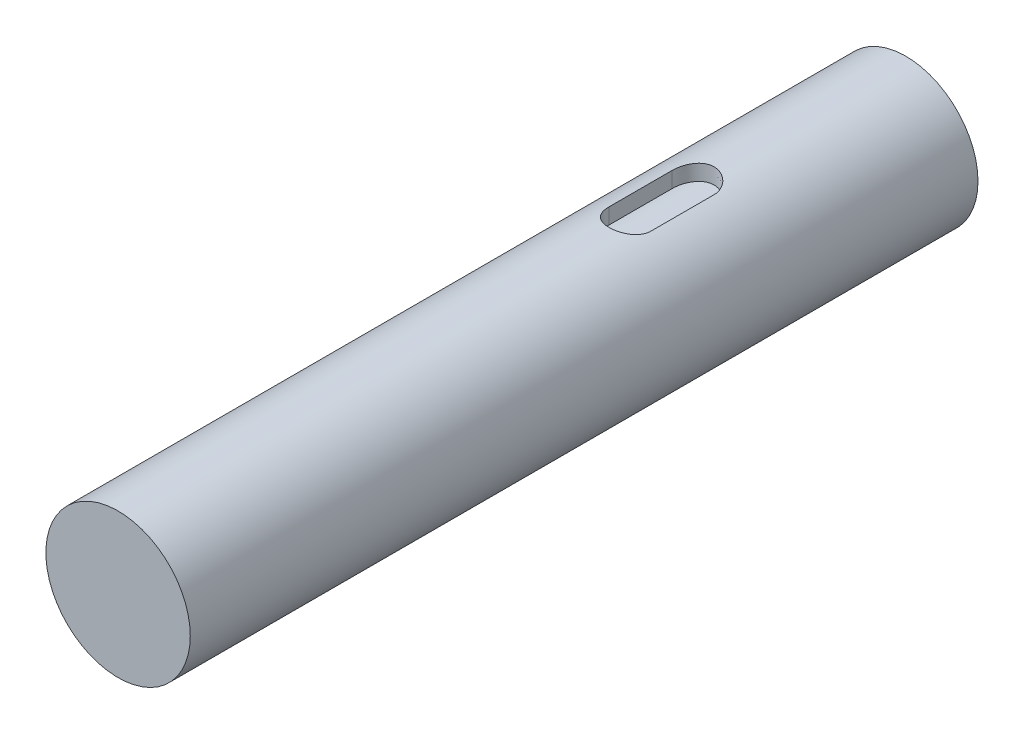
ISO-10303-21;
HEADER;
FILE_DESCRIPTION(('STEP AP214'),'2;1');
FILE_NAME('part.step','',(''),(''),'','','');
FILE_SCHEMA(('AUTOMOTIVE_DESIGN { 1 0 10303 214 1 1 1 1 }'));
ENDSEC;
DATA;
#1=APPLICATION_CONTEXT('core data for automotive mechanical design processes');
#2=APPLICATION_PROTOCOL_DEFINITION('international standard','automotive_design',2000,#1);
#3=PRODUCT_CONTEXT('',#1,'mechanical');
#4=PRODUCT('Part','Part','',(#3));
#5=PRODUCT_RELATED_PRODUCT_CATEGORY('part','',(#4));
#6=PRODUCT_DEFINITION_FORMATION('','',#4);
#7=PRODUCT_DEFINITION_CONTEXT('part definition',#1,'design');
#8=PRODUCT_DEFINITION('design','',#6,#7);
#9=PRODUCT_DEFINITION_SHAPE('','',#8);
#10=(LENGTH_UNIT() NAMED_UNIT(*) SI_UNIT(.MILLI.,.METRE.));
#11=(NAMED_UNIT(*) PLANE_ANGLE_UNIT() SI_UNIT($,.RADIAN.));
#12=(NAMED_UNIT(*) SI_UNIT($,.STERADIAN.) SOLID_ANGLE_UNIT());
#13=UNCERTAINTY_MEASURE_WITH_UNIT(LENGTH_MEASURE(1.E-05),#10,'distance_accuracy_value','');
#14=(GEOMETRIC_REPRESENTATION_CONTEXT(3) GLOBAL_UNCERTAINTY_ASSIGNED_CONTEXT((#13)) GLOBAL_UNIT_ASSIGNED_CONTEXT((#10,
#11,#12)) REPRESENTATION_CONTEXT('',''));
#15=CARTESIAN_POINT('',(0.,0.,0.));
#16=DIRECTION('',(0.,0.,1.));
#17=DIRECTION('',(1.,0.,0.));
#18=AXIS2_PLACEMENT_3D('',#15,#16,#17);
#19=CARTESIAN_POINT('',(0.,0.,300.));
#20=DIRECTION('',(0.,0.,-1.));
#21=DIRECTION('',(-1.,0.,0.));
#22=AXIS2_PLACEMENT_3D('',#19,#20,#21);
#23=CYLINDRICAL_SURFACE('',#22,27.5);
#24=CARTESIAN_POINT('',(0.,0.,0.));
#25=DIRECTION('',(0.,0.,1.));
#26=DIRECTION('',(1.,0.,0.));
#27=AXIS2_PLACEMENT_3D('',#24,#25,#26);
#28=CIRCLE('',#27,27.5);
#29=CARTESIAN_POINT('',(27.5,0.,0.));
#30=VERTEX_POINT('',#29);
#31=EDGE_CURVE('E49',#30,#30,#28,.T.);
#32=ORIENTED_EDGE('',*,*,#31,.T.);
#33=EDGE_LOOP('',(#32));
#34=FACE_BOUND('',#33,.T.);
#35=CARTESIAN_POINT('',(0.,0.,300.));
#36=DIRECTION('',(0.,0.,1.));
#37=DIRECTION('',(1.,0.,0.));
#38=AXIS2_PLACEMENT_3D('',#35,#36,#37);
#39=CIRCLE('',#38,27.5);
#40=CARTESIAN_POINT('',(27.5,0.,300.));
#41=VERTEX_POINT('',#40);
#42=EDGE_CURVE('E11',#41,#41,#39,.T.);
#43=ORIENTED_EDGE('',*,*,#42,.F.);
#44=EDGE_LOOP('',(#43));
#45=FACE_BOUND('',#44,.T.);
#46=DIRECTION('',(0.,0.,-1.));
#47=VECTOR('',#46,1.);
#48=CARTESIAN_POINT('',(8.00000000000003,26.3106442338457,300.));
#49=LINE('',#48,#47);
#50=CARTESIAN_POINT('',(8.00000000000001,26.3106442338457,105.));
#51=VERTEX_POINT('',#50);
#52=CARTESIAN_POINT('',(8.00000000000002,26.3106442338457,81.));
#53=VERTEX_POINT('',#52);
#54=EDGE_CURVE('E185',#51,#53,#49,.T.);
#55=ORIENTED_EDGE('',*,*,#54,.F.);
#56=CARTESIAN_POINT('',(-8.,26.3106442338457,105.));
#57=CARTESIAN_POINT('',(-8.,26.3106442338457,106.063035005528));
#58=CARTESIAN_POINT('',(-7.7887011777006,26.3772734647265,107.105523905988));
#59=CARTESIAN_POINT('',(-6.98411937352506,26.6016258534104,109.039699683214));
#60=CARTESIAN_POINT('',(-6.39053384658964,26.7576658191,109.923095257943));
#61=CARTESIAN_POINT('',(-4.92378688162708,27.0659920504562,111.390000978678));
#62=CARTESIAN_POINT('',(-4.03629409406878,27.2193681309942,111.985161836937));
#63=CARTESIAN_POINT('',(-2.11382482197526,27.4356960197185,112.785621396139));
#64=CARTESIAN_POINT('',(-1.05749070925455,27.4997033906854,112.998980405045));
#65=CARTESIAN_POINT('',(1.04200741030025,27.5002944299277,113.001012103311));
#66=CARTESIAN_POINT('',(2.09275072984243,27.437705693647,112.792846434513));
#67=CARTESIAN_POINT('',(4.03739168654416,27.2196026370311,111.986238582998));
#68=CARTESIAN_POINT('',(4.91590083691859,27.0675862377068,111.397309073584));
#69=CARTESIAN_POINT('',(7.13304107358699,26.6017094965524,109.181662675062));
#70=CARTESIAN_POINT('',(8.,26.3106442338457,107.126189888135));
#71=CARTESIAN_POINT('',(8.,26.3106442338457,105.));
#72=B_SPLINE_CURVE_WITH_KNOTS('',3,(#56,#57,#58,#59,#60,#61,#62,#63,#64,#65,#66,#67,#68,#69,#70,
#71),.UNSPECIFIED.,.F.,.F.,(4,2,2,2,2,2,2,4),(0.,0.125,0.25,0.375,0.5,0.625,0.75,1.),.UNSPECIFIED.);
#73=CARTESIAN_POINT('',(-7.99999999999998,26.3106442338457,105.));
#74=VERTEX_POINT('',#73);
#75=EDGE_CURVE('E110',#74,#51,#72,.T.);
#76=ORIENTED_EDGE('',*,*,#75,.F.);
#77=DIRECTION('',(0.,0.,-1.));
#78=VECTOR('',#77,1.);
#79=CARTESIAN_POINT('',(-7.99999999999997,26.3106442338457,300.));
#80=LINE('',#79,#78);
#81=CARTESIAN_POINT('',(-7.99999999999997,26.3106442338457,81.));
#82=VERTEX_POINT('',#81);
#83=EDGE_CURVE('E106',#74,#82,#80,.T.);
#84=ORIENTED_EDGE('',*,*,#83,.T.);
#85=CARTESIAN_POINT('',(8.,26.3106442338457,81.));
#86=CARTESIAN_POINT('',(8.,26.3106442338457,79.9369649944721));
#87=CARTESIAN_POINT('',(7.78870117770061,26.3772734647265,78.8944760940116));
#88=CARTESIAN_POINT('',(6.98411937352506,26.6016258534104,76.9603003167865));
#89=CARTESIAN_POINT('',(6.39053384658964,26.7576658191,76.0769047420571));
#90=CARTESIAN_POINT('',(4.92378688162708,27.0659920504562,74.6099990213221));
#91=CARTESIAN_POINT('',(4.03629409406879,27.2193681309942,74.014838163063));
#92=CARTESIAN_POINT('',(2.11382482197527,27.4356960197185,73.2143786038611));
#93=CARTESIAN_POINT('',(1.05749070925456,27.4997033906854,73.0010195949551));
#94=CARTESIAN_POINT('',(-1.04200741030024,27.5002944299277,72.9989878966888));
#95=CARTESIAN_POINT('',(-2.09275072984243,27.437705693647,73.2071535654874));
#96=CARTESIAN_POINT('',(-4.03739168654415,27.2196026370311,74.0137614170016));
#97=CARTESIAN_POINT('',(-4.91590083691858,27.0675862377068,74.6026909264165));
#98=CARTESIAN_POINT('',(-7.13304107358698,26.6017094965524,76.8183373249383));
#99=CARTESIAN_POINT('',(-8.,26.3106442338457,78.873810111865));
#100=CARTESIAN_POINT('',(-8.,26.3106442338457,81.));
#101=B_SPLINE_CURVE_WITH_KNOTS('',3,(#85,#86,#87,#88,#89,#90,#91,#92,#93,#94,#95,#96,#97,#98,
#99,#100),.UNSPECIFIED.,.F.,.F.,(4,2,2,2,2,2,2,4),(0.,0.125,0.25,0.375,0.5,0.625,0.75,1.),.UNSPECIFIED.);
#102=EDGE_CURVE('E57',#53,#82,#101,.T.);
#103=ORIENTED_EDGE('',*,*,#102,.F.);
#104=EDGE_LOOP('',(#55,#76,#84,#103));
#105=FACE_BOUND('',#104,.T.);
#106=ADVANCED_FACE('F39',(#34,#45,#105),#23,.T.);
#107=CARTESIAN_POINT('',(0.,0.,300.));
#108=DIRECTION('',(0.,0.,1.));
#109=DIRECTION('',(1.,0.,0.));
#110=AXIS2_PLACEMENT_3D('',#107,#108,#109);
#111=PLANE('',#110);
#112=ORIENTED_EDGE('',*,*,#42,.T.);
#113=EDGE_LOOP('',(#112));
#114=FACE_BOUND('',#113,.T.);
#115=ADVANCED_FACE('F219',(#114),#111,.T.);
#116=CARTESIAN_POINT('',(0.,0.,0.));
#117=DIRECTION('',(0.,0.,1.));
#118=DIRECTION('',(1.,0.,0.));
#119=AXIS2_PLACEMENT_3D('',#116,#117,#118);
#120=PLANE('',#119);
#121=ORIENTED_EDGE('',*,*,#31,.F.);
#122=EDGE_LOOP('',(#121));
#123=FACE_BOUND('',#122,.T.);
#124=ADVANCED_FACE('F217',(#123),#120,.F.);
#125=CARTESIAN_POINT('',(0.,-6.,300.));
#126=DIRECTION('',(0.,0.,-1.));
#127=DIRECTION('',(-1.,0.,0.));
#128=AXIS2_PLACEMENT_3D('',#125,#126,#127);
#129=CYLINDRICAL_SURFACE('',#128,27.5);
#130=DIRECTION('',(0.,0.,-1.));
#131=VECTOR('',#130,1.);
#132=CARTESIAN_POINT('',(8.00000000000003,20.3106442338457,300.));
#133=LINE('',#132,#131);
#134=CARTESIAN_POINT('',(8.00000000000001,20.3106442338457,105.));
#135=VERTEX_POINT('',#134);
#136=CARTESIAN_POINT('',(8.00000000000002,20.3106442338457,81.));
#137=VERTEX_POINT('',#136);
#138=EDGE_CURVE('E95',#135,#137,#133,.T.);
#139=ORIENTED_EDGE('',*,*,#138,.T.);
#140=CARTESIAN_POINT('',(-8.,20.3106442338457,81.));
#141=CARTESIAN_POINT('',(-8.,20.3106442338457,78.873810111865));
#142=CARTESIAN_POINT('',(-7.13304107358698,20.6017094965524,76.8183373249383));
#143=CARTESIAN_POINT('',(-4.91590083691858,21.0675862377068,74.6026909264165));
#144=CARTESIAN_POINT('',(-4.03739168654415,21.2196026370311,74.0137614170016));
#145=CARTESIAN_POINT('',(-2.09275072984243,21.437705693647,73.2071535654874));
#146=CARTESIAN_POINT('',(-1.04200741030024,21.5002944299277,72.9989878966888));
#147=CARTESIAN_POINT('',(1.05749070925456,21.4997033906854,73.0010195949551));
#148=CARTESIAN_POINT('',(2.11382482197527,21.4356960197185,73.2143786038611));
#149=CARTESIAN_POINT('',(4.03629409406879,21.2193681309942,74.014838163063));
#150=CARTESIAN_POINT('',(4.92378688162708,21.0659920504562,74.6099990213221));
#151=CARTESIAN_POINT('',(6.39053384658964,20.7576658191001,76.0769047420571));
#152=CARTESIAN_POINT('',(6.98411937352506,20.6016258534104,76.9603003167865));
#153=CARTESIAN_POINT('',(7.78870117770061,20.3772734647265,78.8944760940116));
#154=CARTESIAN_POINT('',(8.,20.3106442338457,79.9369649944721));
#155=CARTESIAN_POINT('',(8.,20.3106442338457,81.));
#156=B_SPLINE_CURVE_WITH_KNOTS('',3,(#140,#141,#142,#143,#144,#145,#146,#147,#148,#149,#150,
#151,#152,#153,#154,#155),.UNSPECIFIED.,.F.,.F.,(4,2,2,2,2,2,2,4),(0.,0.25,0.375,0.5,0.625,0.75,
0.875,1.),.UNSPECIFIED.);
#157=CARTESIAN_POINT('',(-7.99999999999998,20.3106442338457,81.));
#158=VERTEX_POINT('',#157);
#159=EDGE_CURVE('E92',#137,#158,#156,.F.);
#160=ORIENTED_EDGE('',*,*,#159,.T.);
#161=DIRECTION('',(0.,0.,-1.));
#162=VECTOR('',#161,1.);
#163=CARTESIAN_POINT('',(-7.99999999999997,20.3106442338457,300.));
#164=LINE('',#163,#162);
#165=CARTESIAN_POINT('',(-7.99999999999998,20.3106442338457,105.));
#166=VERTEX_POINT('',#165);
#167=EDGE_CURVE('E88',#166,#158,#164,.T.);
#168=ORIENTED_EDGE('',*,*,#167,.F.);
#169=CARTESIAN_POINT('',(8.,20.3106442338457,105.));
#170=CARTESIAN_POINT('',(8.,20.3106442338457,107.126189888135));
#171=CARTESIAN_POINT('',(7.13304107358699,20.6017094965524,109.181662675062));
#172=CARTESIAN_POINT('',(4.91590083691859,21.0675862377068,111.397309073584));
#173=CARTESIAN_POINT('',(4.03739168654416,21.2196026370311,111.986238582998));
#174=CARTESIAN_POINT('',(2.09275072984243,21.437705693647,112.792846434513));
#175=CARTESIAN_POINT('',(1.04200741030025,21.5002944299277,113.001012103311));
#176=CARTESIAN_POINT('',(-1.05749070925455,21.4997033906854,112.998980405045));
#177=CARTESIAN_POINT('',(-2.11382482197526,21.4356960197185,112.785621396139));
#178=CARTESIAN_POINT('',(-4.03629409406878,21.2193681309942,111.985161836937));
#179=CARTESIAN_POINT('',(-4.92378688162708,21.0659920504562,111.390000978678));
#180=CARTESIAN_POINT('',(-6.39053384658964,20.7576658191,109.923095257943));
#181=CARTESIAN_POINT('',(-6.98411937352506,20.6016258534104,109.039699683214));
#182=CARTESIAN_POINT('',(-7.7887011777006,20.3772734647265,107.105523905988));
#183=CARTESIAN_POINT('',(-8.,20.3106442338457,106.063035005528));
#184=CARTESIAN_POINT('',(-8.,20.3106442338457,105.));
#185=B_SPLINE_CURVE_WITH_KNOTS('',3,(#169,#170,#171,#172,#173,#174,#175,#176,#177,#178,#179,
#180,#181,#182,#183,#184),.UNSPECIFIED.,.F.,.F.,(4,2,2,2,2,2,2,4),(0.,0.25,0.375,0.5,0.625,0.75,
0.875,1.),.UNSPECIFIED.);
#186=EDGE_CURVE('E84',#166,#135,#185,.F.);
#187=ORIENTED_EDGE('',*,*,#186,.T.);
#188=EDGE_LOOP('',(#139,#160,#168,#187));
#189=FACE_BOUND('',#188,.T.);
#190=ADVANCED_FACE('F94',(#189),#129,.T.);
#191=CARTESIAN_POINT('',(8.00000000000003,26.3106442338457,300.));
#192=DIRECTION('',(-1.,0.,0.));
#193=DIRECTION('',(0.,0.,1.));
#194=AXIS2_PLACEMENT_3D('',#191,#192,#193);
#195=PLANE('',#194);
#196=ORIENTED_EDGE('',*,*,#138,.F.);
#197=DIRECTION('',(0.,-1.,0.));
#198=VECTOR('',#197,1.);
#199=CARTESIAN_POINT('',(8.,26.3106442338457,105.));
#200=LINE('',#199,#198);
#201=EDGE_CURVE('E67',#51,#135,#200,.T.);
#202=ORIENTED_EDGE('',*,*,#201,.F.);
#203=ORIENTED_EDGE('',*,*,#54,.T.);
#204=DIRECTION('',(0.,-1.,0.));
#205=VECTOR('',#204,1.);
#206=CARTESIAN_POINT('',(8.,26.3106442338457,81.));
#207=LINE('',#206,#205);
#208=EDGE_CURVE('E187',#53,#137,#207,.T.);
#209=ORIENTED_EDGE('',*,*,#208,.T.);
#210=EDGE_LOOP('',(#196,#202,#203,#209));
#211=FACE_BOUND('',#210,.T.);
#212=ADVANCED_FACE('F153',(#211),#195,.T.);
#213=CARTESIAN_POINT('',(-8.,26.3106442338457,105.));
#214=CARTESIAN_POINT('',(-8.,26.3106442338457,106.063035005528));
#215=CARTESIAN_POINT('',(-7.7887011777006,26.3772734647265,107.105523905988));
#216=CARTESIAN_POINT('',(-6.98411937352506,26.6016258534104,109.039699683214));
#217=CARTESIAN_POINT('',(-6.39053384658964,26.7576658191,109.923095257943));
#218=CARTESIAN_POINT('',(-4.92378688162708,27.0659920504562,111.390000978678));
#219=CARTESIAN_POINT('',(-4.03629409406878,27.2193681309942,111.985161836937));
#220=CARTESIAN_POINT('',(-2.11382482197526,27.4356960197185,112.785621396139));
#221=CARTESIAN_POINT('',(-1.05749070925455,27.4997033906854,112.998980405045));
#222=CARTESIAN_POINT('',(1.04200741030025,27.5002944299277,113.001012103311));
#223=CARTESIAN_POINT('',(2.09275072984243,27.437705693647,112.792846434513));
#224=CARTESIAN_POINT('',(4.03739168654416,27.2196026370311,111.986238582998));
#225=CARTESIAN_POINT('',(4.91590083691859,27.0675862377068,111.397309073584));
#226=CARTESIAN_POINT('',(7.13304107358699,26.6017094965524,109.181662675062));
#227=CARTESIAN_POINT('',(8.,26.3106442338457,107.126189888135));
#228=CARTESIAN_POINT('',(8.,26.3106442338457,105.));
#229=B_SPLINE_CURVE_WITH_KNOTS('',3,(#213,#214,#215,#216,#217,#218,#219,#220,#221,#222,#223,
#224,#225,#226,#227,#228),.UNSPECIFIED.,.F.,.F.,(4,2,2,2,2,2,2,4),(0.,0.125,0.25,0.375,0.5,
0.625,0.75,1.),.UNSPECIFIED.);
#230=DIRECTION('',(0.,-1.,0.));
#231=VECTOR('',#230,1.);
#232=SURFACE_OF_LINEAR_EXTRUSION('',#229,#231);
#233=ORIENTED_EDGE('',*,*,#186,.F.);
#234=DIRECTION('',(0.,-1.,0.));
#235=VECTOR('',#234,1.);
#236=CARTESIAN_POINT('',(-7.99999999999997,26.3106442338457,105.));
#237=LINE('',#236,#235);
#238=EDGE_CURVE('E109',#74,#166,#237,.T.);
#239=ORIENTED_EDGE('',*,*,#238,.F.);
#240=ORIENTED_EDGE('',*,*,#75,.T.);
#241=ORIENTED_EDGE('',*,*,#201,.T.);
#242=EDGE_LOOP('',(#233,#239,#240,#241));
#243=FACE_BOUND('',#242,.T.);
#244=ADVANCED_FACE('F131',(#243),#232,.T.);
#245=CARTESIAN_POINT('',(8.,26.3106442338457,81.));
#246=CARTESIAN_POINT('',(8.,26.3106442338457,79.9369649944721));
#247=CARTESIAN_POINT('',(7.78870117770061,26.3772734647265,78.8944760940116));
#248=CARTESIAN_POINT('',(6.98411937352506,26.6016258534104,76.9603003167865));
#249=CARTESIAN_POINT('',(6.39053384658964,26.7576658191,76.0769047420571));
#250=CARTESIAN_POINT('',(4.92378688162708,27.0659920504562,74.6099990213221));
#251=CARTESIAN_POINT('',(4.03629409406879,27.2193681309942,74.014838163063));
#252=CARTESIAN_POINT('',(2.11382482197527,27.4356960197185,73.2143786038611));
#253=CARTESIAN_POINT('',(1.05749070925456,27.4997033906854,73.0010195949551));
#254=CARTESIAN_POINT('',(-1.04200741030024,27.5002944299277,72.9989878966888));
#255=CARTESIAN_POINT('',(-2.09275072984243,27.437705693647,73.2071535654874));
#256=CARTESIAN_POINT('',(-4.03739168654415,27.2196026370311,74.0137614170016));
#257=CARTESIAN_POINT('',(-4.91590083691858,27.0675862377068,74.6026909264165));
#258=CARTESIAN_POINT('',(-7.13304107358698,26.6017094965524,76.8183373249383));
#259=CARTESIAN_POINT('',(-8.,26.3106442338457,78.873810111865));
#260=CARTESIAN_POINT('',(-8.,26.3106442338457,81.));
#261=B_SPLINE_CURVE_WITH_KNOTS('',3,(#245,#246,#247,#248,#249,#250,#251,#252,#253,#254,#255,
#256,#257,#258,#259,#260),.UNSPECIFIED.,.F.,.F.,(4,2,2,2,2,2,2,4),(0.,0.125,0.25,0.375,0.5,
0.625,0.75,1.),.UNSPECIFIED.);
#262=DIRECTION('',(0.,-1.,0.));
#263=VECTOR('',#262,1.);
#264=SURFACE_OF_LINEAR_EXTRUSION('',#261,#263);
#265=ORIENTED_EDGE('',*,*,#159,.F.);
#266=ORIENTED_EDGE('',*,*,#208,.F.);
#267=ORIENTED_EDGE('',*,*,#102,.T.);
#268=DIRECTION('',(0.,-1.,0.));
#269=VECTOR('',#268,1.);
#270=CARTESIAN_POINT('',(-8.,26.3106442338457,81.));
#271=LINE('',#270,#269);
#272=EDGE_CURVE('E98',#82,#158,#271,.T.);
#273=ORIENTED_EDGE('',*,*,#272,.T.);
#274=EDGE_LOOP('',(#265,#266,#267,#273));
#275=FACE_BOUND('',#274,.T.);
#276=ADVANCED_FACE('F102',(#275),#264,.T.);
#277=CARTESIAN_POINT('',(-7.99999999999997,26.3106442338457,300.));
#278=DIRECTION('',(-1.,0.,0.));
#279=DIRECTION('',(0.,0.,1.));
#280=AXIS2_PLACEMENT_3D('',#277,#278,#279);
#281=PLANE('',#280);
#282=ORIENTED_EDGE('',*,*,#167,.T.);
#283=ORIENTED_EDGE('',*,*,#272,.F.);
#284=ORIENTED_EDGE('',*,*,#83,.F.);
#285=ORIENTED_EDGE('',*,*,#238,.T.);
#286=EDGE_LOOP('',(#282,#283,#284,#285));
#287=FACE_BOUND('',#286,.T.);
#288=ADVANCED_FACE('F108',(#287),#281,.F.);
#289=CLOSED_SHELL('',(#106,#115,#124,#190,#212,#244,#276,#288));
#290=MANIFOLD_SOLID_BREP('B2',#289);
#291=ADVANCED_BREP_SHAPE_REPRESENTATION('',(#18,#290),#14);
#292=SHAPE_DEFINITION_REPRESENTATION(#9,#291);
ENDSEC;
END-ISO-10303-21;
